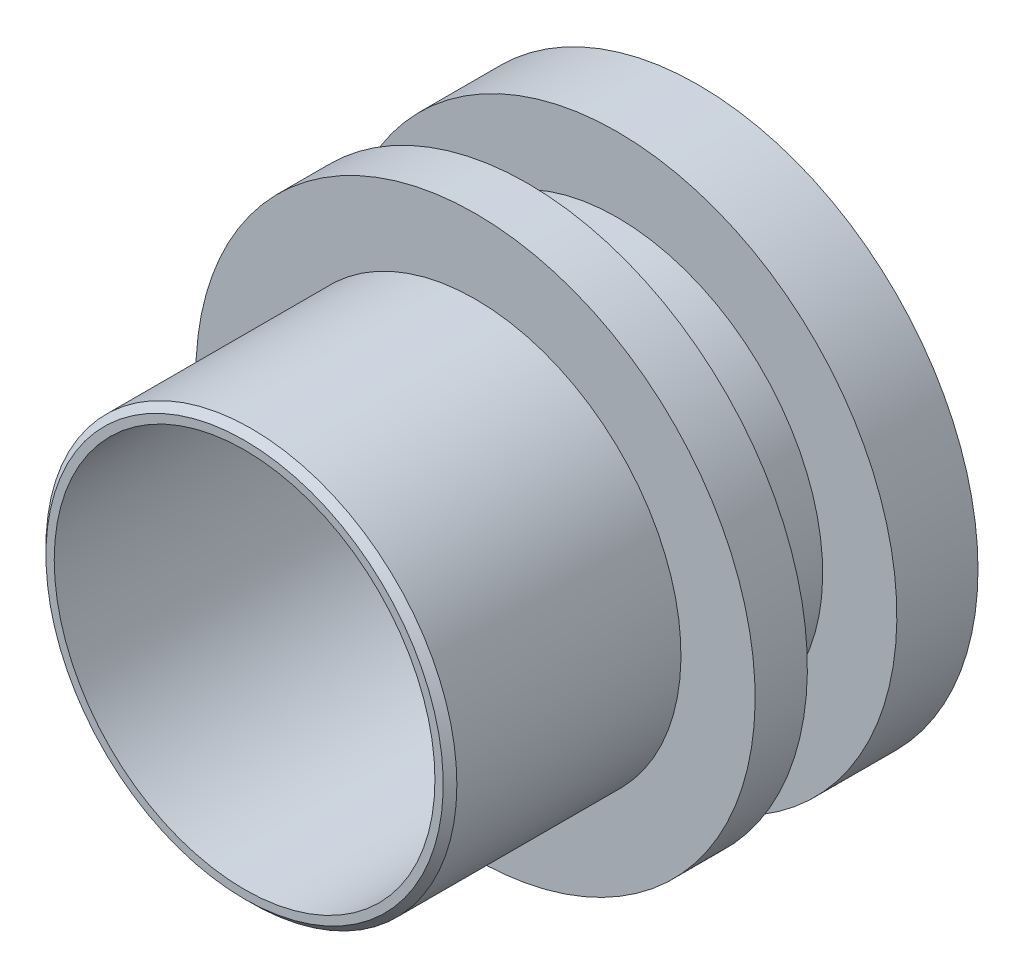
ISO-10303-21;
HEADER;
FILE_DESCRIPTION(('STEP AP214'),'2;1');
FILE_NAME('part.step','',(''),(''),'','','');
FILE_SCHEMA(('AUTOMOTIVE_DESIGN { 1 0 10303 214 1 1 1 1 }'));
ENDSEC;
DATA;
#1=APPLICATION_CONTEXT('core data for automotive mechanical design processes');
#2=APPLICATION_PROTOCOL_DEFINITION('international standard','automotive_design',2000,#1);
#3=PRODUCT_CONTEXT('',#1,'mechanical');
#4=PRODUCT('Part','Part','',(#3));
#5=PRODUCT_RELATED_PRODUCT_CATEGORY('part','',(#4));
#6=PRODUCT_DEFINITION_FORMATION('','',#4);
#7=PRODUCT_DEFINITION_CONTEXT('part definition',#1,'design');
#8=PRODUCT_DEFINITION('design','',#6,#7);
#9=PRODUCT_DEFINITION_SHAPE('','',#8);
#10=(LENGTH_UNIT() NAMED_UNIT(*) SI_UNIT(.MILLI.,.METRE.));
#11=(NAMED_UNIT(*) PLANE_ANGLE_UNIT() SI_UNIT($,.RADIAN.));
#12=(NAMED_UNIT(*) SI_UNIT($,.STERADIAN.) SOLID_ANGLE_UNIT());
#13=UNCERTAINTY_MEASURE_WITH_UNIT(LENGTH_MEASURE(1.E-05),#10,'distance_accuracy_value','');
#14=(GEOMETRIC_REPRESENTATION_CONTEXT(3) GLOBAL_UNCERTAINTY_ASSIGNED_CONTEXT((#13)) GLOBAL_UNIT_ASSIGNED_CONTEXT((#10,
#11,#12)) REPRESENTATION_CONTEXT('',''));
#15=CARTESIAN_POINT('',(0.,0.,0.));
#16=DIRECTION('',(0.,0.,1.));
#17=DIRECTION('',(1.,0.,0.));
#18=AXIS2_PLACEMENT_3D('',#15,#16,#17);
#19=CARTESIAN_POINT('',(0.,0.,2.4906));
#20=DIRECTION('',(0.,0.,-1.));
#21=DIRECTION('',(0.,1.,0.));
#22=AXIS2_PLACEMENT_3D('',#19,#20,#21);
#23=CYLINDRICAL_SURFACE('',#22,3.125);
#24=CARTESIAN_POINT('',(0.,0.,1.90678));
#25=DIRECTION('',(0.,0.,-1.));
#26=DIRECTION('',(0.,1.,0.));
#27=AXIS2_PLACEMENT_3D('',#24,#25,#26);
#28=CIRCLE('',#27,3.125);
#29=CARTESIAN_POINT('',(0.,3.125,1.90678));
#30=VERTEX_POINT('',#29);
#31=EDGE_CURVE('E71',#30,#30,#28,.T.);
#32=ORIENTED_EDGE('',*,*,#31,.F.);
#33=EDGE_LOOP('',(#32));
#34=FACE_BOUND('',#33,.T.);
#35=CARTESIAN_POINT('',(0.,0.,2.4906));
#36=DIRECTION('',(0.,0.,-1.));
#37=DIRECTION('',(0.,1.,0.));
#38=AXIS2_PLACEMENT_3D('',#35,#36,#37);
#39=CIRCLE('',#38,3.125);
#40=CARTESIAN_POINT('',(0.,3.125,2.4906));
#41=VERTEX_POINT('',#40);
#42=EDGE_CURVE('E69',#41,#41,#39,.T.);
#43=ORIENTED_EDGE('',*,*,#42,.T.);
#44=EDGE_LOOP('',(#43));
#45=FACE_BOUND('',#44,.T.);
#46=ADVANCED_FACE('F40',(#34,#45),#23,.T.);
#47=CARTESIAN_POINT('',(0.,0.,1.90678));
#48=DIRECTION('',(0.,0.,-1.));
#49=DIRECTION('',(0.,1.,0.));
#50=AXIS2_PLACEMENT_3D('',#47,#48,#49);
#51=PLANE('',#50);
#52=ORIENTED_EDGE('',*,*,#31,.T.);
#53=EDGE_LOOP('',(#52));
#54=FACE_BOUND('',#53,.T.);
#55=CARTESIAN_POINT('',(0.,0.,1.90678));
#56=DIRECTION('',(0.,0.,-1.));
#57=DIRECTION('',(0.,1.,0.));
#58=AXIS2_PLACEMENT_3D('',#55,#56,#57);
#59=CIRCLE('',#58,2.29616);
#60=CARTESIAN_POINT('',(0.,2.29616,1.90678));
#61=VERTEX_POINT('',#60);
#62=EDGE_CURVE('E66',#61,#61,#59,.T.);
#63=ORIENTED_EDGE('',*,*,#62,.F.);
#64=EDGE_LOOP('',(#63));
#65=FACE_BOUND('',#64,.T.);
#66=ADVANCED_FACE('F94',(#54,#65),#51,.T.);
#67=CARTESIAN_POINT('',(0.,0.,2.4906));
#68=DIRECTION('',(0.,0.,-1.));
#69=DIRECTION('',(0.,1.,0.));
#70=AXIS2_PLACEMENT_3D('',#67,#68,#69);
#71=PLANE('',#70);
#72=ORIENTED_EDGE('',*,*,#42,.F.);
#73=EDGE_LOOP('',(#72));
#74=FACE_BOUND('',#73,.T.);
#75=CARTESIAN_POINT('',(0.,0.,2.4906));
#76=DIRECTION('',(0.,0.,-1.));
#77=DIRECTION('',(0.,1.,0.));
#78=AXIS2_PLACEMENT_3D('',#75,#76,#77);
#79=CIRCLE('',#78,2.29616);
#80=CARTESIAN_POINT('',(0.,2.29616,2.4906));
#81=VERTEX_POINT('',#80);
#82=EDGE_CURVE('E63',#81,#81,#79,.F.);
#83=ORIENTED_EDGE('',*,*,#82,.F.);
#84=EDGE_LOOP('',(#83));
#85=FACE_BOUND('',#84,.T.);
#86=ADVANCED_FACE('F99',(#74,#85),#71,.F.);
#87=CARTESIAN_POINT('',(0.,0.,1.90678));
#88=DIRECTION('',(0.,0.,-1.));
#89=DIRECTION('',(0.,1.,0.));
#90=AXIS2_PLACEMENT_3D('',#87,#88,#89);
#91=CYLINDRICAL_SURFACE('',#90,2.29616);
#92=CARTESIAN_POINT('',(0.,0.,0.90678));
#93=DIRECTION('',(0.,0.,-1.));
#94=DIRECTION('',(0.,1.,0.));
#95=AXIS2_PLACEMENT_3D('',#92,#93,#94);
#96=CIRCLE('',#95,2.29616);
#97=CARTESIAN_POINT('',(0.,2.29616,0.906780000000001));
#98=VERTEX_POINT('',#97);
#99=EDGE_CURVE('E60',#98,#98,#96,.F.);
#100=ORIENTED_EDGE('',*,*,#99,.T.);
#101=EDGE_LOOP('',(#100));
#102=FACE_BOUND('',#101,.T.);
#103=ORIENTED_EDGE('',*,*,#62,.T.);
#104=EDGE_LOOP('',(#103));
#105=FACE_BOUND('',#104,.T.);
#106=ADVANCED_FACE('F105',(#102,#105),#91,.T.);
#107=CARTESIAN_POINT('',(0.,0.,4.9948));
#108=DIRECTION('',(0.,0.,-1.));
#109=DIRECTION('',(0.,1.,0.));
#110=AXIS2_PLACEMENT_3D('',#107,#108,#109);
#111=CYLINDRICAL_SURFACE('',#110,2.29616);
#112=ORIENTED_EDGE('',*,*,#82,.T.);
#113=EDGE_LOOP('',(#112));
#114=FACE_BOUND('',#113,.T.);
#115=CARTESIAN_POINT('',(0.,0.,4.99479999996311));
#116=DIRECTION('',(0.,0.,-1.));
#117=DIRECTION('',(1.,0.,0.));
#118=AXIS2_PLACEMENT_3D('',#115,#116,#117);
#119=CIRCLE('',#118,2.29616000001442);
#120=CARTESIAN_POINT('',(2.29616000001442,0.,4.99479999996311));
#121=VERTEX_POINT('',#120);
#122=EDGE_CURVE('E55',#121,#121,#119,.F.);
#123=ORIENTED_EDGE('',*,*,#122,.F.);
#124=EDGE_LOOP('',(#123));
#125=FACE_BOUND('',#124,.T.);
#126=ADVANCED_FACE('F109',(#114,#125),#111,.T.);
#127=CARTESIAN_POINT('',(0.,0.,0.90678));
#128=DIRECTION('',(0.,0.,-1.));
#129=DIRECTION('',(0.,1.,0.));
#130=AXIS2_PLACEMENT_3D('',#127,#128,#129);
#131=PLANE('',#130);
#132=CARTESIAN_POINT('',(0.,0.,0.90678));
#133=DIRECTION('',(0.,0.,-1.));
#134=DIRECTION('',(0.,1.,0.));
#135=AXIS2_PLACEMENT_3D('',#132,#133,#134);
#136=CIRCLE('',#135,3.125);
#137=CARTESIAN_POINT('',(0.,3.125,0.906780000000001));
#138=VERTEX_POINT('',#137);
#139=EDGE_CURVE('E52',#138,#138,#136,.T.);
#140=ORIENTED_EDGE('',*,*,#139,.F.);
#141=EDGE_LOOP('',(#140));
#142=FACE_BOUND('',#141,.T.);
#143=ORIENTED_EDGE('',*,*,#99,.F.);
#144=EDGE_LOOP('',(#143));
#145=FACE_BOUND('',#144,.T.);
#146=ADVANCED_FACE('F112',(#142,#145),#131,.F.);
#147=CARTESIAN_POINT('',(0.,0.,4.99480000001995));
#148=DIRECTION('',(0.,0.,-1.));
#149=DIRECTION('',(0.,1.,0.));
#150=AXIS2_PLACEMENT_3D('',#147,#148,#149);
#151=CONICAL_SURFACE('',#150,2.29615999995758,0.785398163397448);
#152=ORIENTED_EDGE('',*,*,#122,.T.);
#153=EDGE_LOOP('',(#152));
#154=FACE_BOUND('',#153,.T.);
#155=CARTESIAN_POINT('',(0.,0.,5.07099999998673));
#156=DIRECTION('',(0.,0.,-1.));
#157=DIRECTION('',(0.,1.,0.));
#158=AXIS2_PLACEMENT_3D('',#155,#156,#157);
#159=CIRCLE('',#158,2.21995999999081);
#160=CARTESIAN_POINT('',(0.,2.2199599999908,5.07099999998673));
#161=VERTEX_POINT('',#160);
#162=EDGE_CURVE('E47',#161,#161,#159,.T.);
#163=ORIENTED_EDGE('',*,*,#162,.T.);
#164=EDGE_LOOP('',(#163));
#165=FACE_BOUND('',#164,.T.);
#166=ADVANCED_FACE('F117',(#154,#165),#151,.T.);
#167=CARTESIAN_POINT('',(0.,0.,0.90678));
#168=DIRECTION('',(0.,0.,-1.));
#169=DIRECTION('',(0.,1.,0.));
#170=AXIS2_PLACEMENT_3D('',#167,#168,#169);
#171=CYLINDRICAL_SURFACE('',#170,3.125);
#172=CARTESIAN_POINT('',(0.,0.,0.));
#173=DIRECTION('',(0.,0.,1.));
#174=DIRECTION('',(1.,0.,0.));
#175=AXIS2_PLACEMENT_3D('',#172,#173,#174);
#176=CIRCLE('',#175,3.125);
#177=CARTESIAN_POINT('',(3.125,0.,0.));
#178=VERTEX_POINT('',#177);
#179=EDGE_CURVE('E73',#178,#178,#176,.F.);
#180=ORIENTED_EDGE('',*,*,#179,.F.);
#181=EDGE_LOOP('',(#180));
#182=FACE_BOUND('',#181,.T.);
#183=ORIENTED_EDGE('',*,*,#139,.T.);
#184=EDGE_LOOP('',(#183));
#185=FACE_BOUND('',#184,.T.);
#186=ADVANCED_FACE('F120',(#182,#185),#171,.T.);
#187=CARTESIAN_POINT('',(0.,0.,5.071));
#188=DIRECTION('',(0.,0.,-1.));
#189=DIRECTION('',(0.,1.,0.));
#190=AXIS2_PLACEMENT_3D('',#187,#188,#189);
#191=PLANE('',#190);
#192=ORIENTED_EDGE('',*,*,#162,.F.);
#193=EDGE_LOOP('',(#192));
#194=FACE_BOUND('',#193,.T.);
#195=CARTESIAN_POINT('',(0.,0.,5.071));
#196=DIRECTION('',(0.,0.,1.));
#197=DIRECTION('',(0.,-1.,0.));
#198=AXIS2_PLACEMENT_3D('',#195,#196,#197);
#199=CIRCLE('',#198,2.12725);
#200=CARTESIAN_POINT('',(0.,-2.12725,5.071));
#201=VERTEX_POINT('',#200);
#202=EDGE_CURVE('E12',#201,#201,#199,.F.);
#203=ORIENTED_EDGE('',*,*,#202,.T.);
#204=EDGE_LOOP('',(#203));
#205=FACE_BOUND('',#204,.T.);
#206=ADVANCED_FACE('F91',(#194,#205),#191,.F.);
#207=CARTESIAN_POINT('',(0.,0.,-2.929));
#208=DIRECTION('',(0.,0.,1.));
#209=DIRECTION('',(0.,-1.,0.));
#210=AXIS2_PLACEMENT_3D('',#207,#208,#209);
#211=CYLINDRICAL_SURFACE('',#210,2.12725);
#212=CARTESIAN_POINT('',(0.,0.,0.));
#213=DIRECTION('',(0.,0.,1.));
#214=DIRECTION('',(1.,0.,0.));
#215=AXIS2_PLACEMENT_3D('',#212,#213,#214);
#216=CIRCLE('',#215,2.12725);
#217=CARTESIAN_POINT('',(2.12725,0.,0.));
#218=VERTEX_POINT('',#217);
#219=EDGE_CURVE('E43',#218,#218,#216,.F.);
#220=ORIENTED_EDGE('',*,*,#219,.T.);
#221=EDGE_LOOP('',(#220));
#222=FACE_BOUND('',#221,.T.);
#223=ORIENTED_EDGE('',*,*,#202,.F.);
#224=EDGE_LOOP('',(#223));
#225=FACE_BOUND('',#224,.T.);
#226=ADVANCED_FACE('F82',(#222,#225),#211,.F.);
#227=CARTESIAN_POINT('',(-3.35279999999201,-3.125,0.));
#228=DIRECTION('',(0.,0.,1.));
#229=DIRECTION('',(1.,0.,0.));
#230=AXIS2_PLACEMENT_3D('',#227,#228,#229);
#231=PLANE('',#230);
#232=ORIENTED_EDGE('',*,*,#179,.T.);
#233=EDGE_LOOP('',(#232));
#234=FACE_BOUND('',#233,.T.);
#235=ORIENTED_EDGE('',*,*,#219,.F.);
#236=EDGE_LOOP('',(#235));
#237=FACE_BOUND('',#236,.T.);
#238=ADVANCED_FACE('F85',(#234,#237),#231,.F.);
#239=CLOSED_SHELL('',(#46,#66,#86,#106,#126,#146,#166,#186,#206,#226,#238));
#240=MANIFOLD_SOLID_BREP('B2',#239);
#241=ADVANCED_BREP_SHAPE_REPRESENTATION('',(#18,#240),#14);
#242=SHAPE_DEFINITION_REPRESENTATION(#9,#241);
ENDSEC;
END-ISO-10303-21;
